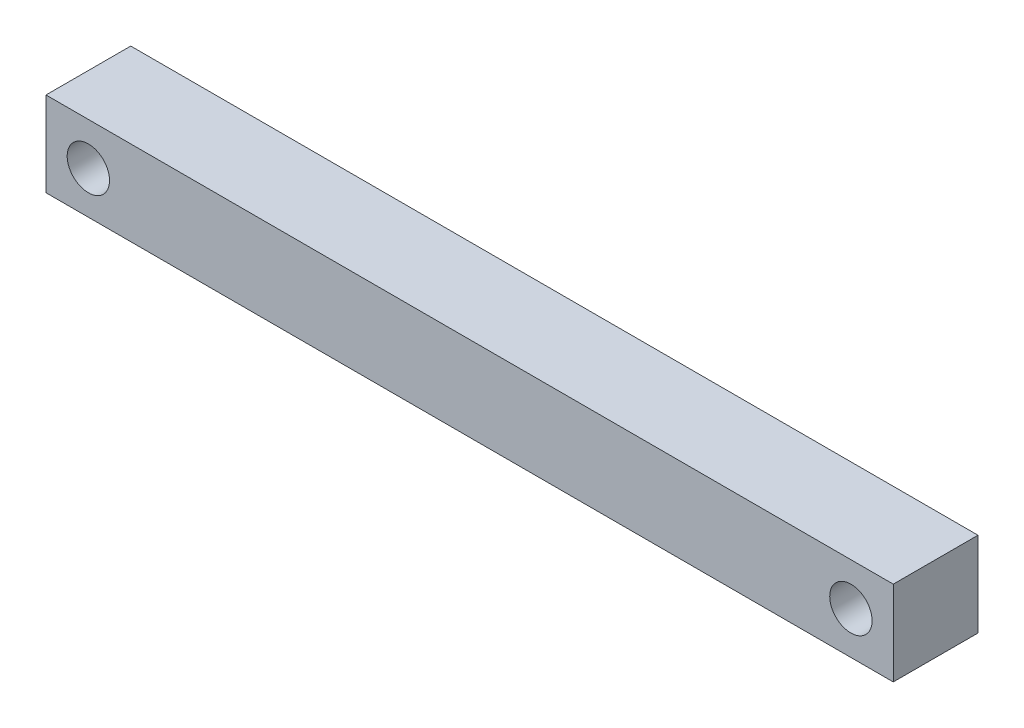
ISO-10303-21;
HEADER;
FILE_DESCRIPTION(('STEP AP214'),'2;1');
FILE_NAME('part.step','',(''),(''),'','','');
FILE_SCHEMA(('AUTOMOTIVE_DESIGN { 1 0 10303 214 1 1 1 1 }'));
ENDSEC;
DATA;
#1=APPLICATION_CONTEXT('core data for automotive mechanical design processes');
#2=APPLICATION_PROTOCOL_DEFINITION('international standard','automotive_design',2000,#1);
#3=PRODUCT_CONTEXT('',#1,'mechanical');
#4=PRODUCT('Part','Part','',(#3));
#5=PRODUCT_RELATED_PRODUCT_CATEGORY('part','',(#4));
#6=PRODUCT_DEFINITION_FORMATION('','',#4);
#7=PRODUCT_DEFINITION_CONTEXT('part definition',#1,'design');
#8=PRODUCT_DEFINITION('design','',#6,#7);
#9=PRODUCT_DEFINITION_SHAPE('','',#8);
#10=(LENGTH_UNIT() NAMED_UNIT(*) SI_UNIT(.MILLI.,.METRE.));
#11=(NAMED_UNIT(*) PLANE_ANGLE_UNIT() SI_UNIT($,.RADIAN.));
#12=(NAMED_UNIT(*) SI_UNIT($,.STERADIAN.) SOLID_ANGLE_UNIT());
#13=UNCERTAINTY_MEASURE_WITH_UNIT(LENGTH_MEASURE(1.E-05),#10,'distance_accuracy_value','');
#14=(GEOMETRIC_REPRESENTATION_CONTEXT(3) GLOBAL_UNCERTAINTY_ASSIGNED_CONTEXT((#13)) GLOBAL_UNIT_ASSIGNED_CONTEXT((#10,
#11,#12)) REPRESENTATION_CONTEXT('',''));
#15=CARTESIAN_POINT('',(0.,0.,0.));
#16=DIRECTION('',(0.,0.,1.));
#17=DIRECTION('',(1.,0.,0.));
#18=AXIS2_PLACEMENT_3D('',#15,#16,#17);
#19=CARTESIAN_POINT('',(100.,10.,20.));
#20=DIRECTION('',(-1.,0.,0.));
#21=DIRECTION('',(0.,-1.,0.));
#22=AXIS2_PLACEMENT_3D('',#19,#20,#21);
#23=PLANE('',#22);
#24=DIRECTION('',(0.,1.,0.));
#25=VECTOR('',#24,1.);
#26=CARTESIAN_POINT('',(100.,10.,0.));
#27=LINE('',#26,#25);
#28=CARTESIAN_POINT('',(100.,-10.,0.));
#29=VERTEX_POINT('',#28);
#30=CARTESIAN_POINT('',(100.,10.,0.));
#31=VERTEX_POINT('',#30);
#32=EDGE_CURVE('E101',#29,#31,#27,.T.);
#33=ORIENTED_EDGE('',*,*,#32,.T.);
#34=DIRECTION('',(0.,0.,-1.));
#35=VECTOR('',#34,1.);
#36=CARTESIAN_POINT('',(100.,10.,20.));
#37=LINE('',#36,#35);
#38=CARTESIAN_POINT('',(100.,10.,20.));
#39=VERTEX_POINT('',#38);
#40=EDGE_CURVE('E11',#39,#31,#37,.T.);
#41=ORIENTED_EDGE('',*,*,#40,.F.);
#42=DIRECTION('',(0.,1.,0.));
#43=VECTOR('',#42,1.);
#44=CARTESIAN_POINT('',(100.,10.,20.));
#45=LINE('',#44,#43);
#46=CARTESIAN_POINT('',(100.,-10.,20.));
#47=VERTEX_POINT('',#46);
#48=EDGE_CURVE('E89',#47,#39,#45,.T.);
#49=ORIENTED_EDGE('',*,*,#48,.F.);
#50=DIRECTION('',(0.,0.,-1.));
#51=VECTOR('',#50,1.);
#52=CARTESIAN_POINT('',(100.,-10.,20.));
#53=LINE('',#52,#51);
#54=EDGE_CURVE('E97',#47,#29,#53,.T.);
#55=ORIENTED_EDGE('',*,*,#54,.T.);
#56=EDGE_LOOP('',(#33,#41,#49,#55));
#57=FACE_BOUND('',#56,.T.);
#58=ADVANCED_FACE('F38',(#57),#23,.F.);
#59=CARTESIAN_POINT('',(-100.,10.,20.));
#60=DIRECTION('',(0.,-1.,0.));
#61=DIRECTION('',(0.,0.,-1.));
#62=AXIS2_PLACEMENT_3D('',#59,#60,#61);
#63=PLANE('',#62);
#64=DIRECTION('',(-1.,0.,0.));
#65=VECTOR('',#64,1.);
#66=CARTESIAN_POINT('',(-100.,10.,0.));
#67=LINE('',#66,#65);
#68=CARTESIAN_POINT('',(-100.,10.,0.));
#69=VERTEX_POINT('',#68);
#70=EDGE_CURVE('E93',#31,#69,#67,.T.);
#71=ORIENTED_EDGE('',*,*,#70,.T.);
#72=DIRECTION('',(0.,0.,-1.));
#73=VECTOR('',#72,1.);
#74=CARTESIAN_POINT('',(-100.,10.,20.));
#75=LINE('',#74,#73);
#76=CARTESIAN_POINT('',(-100.,10.,20.));
#77=VERTEX_POINT('',#76);
#78=EDGE_CURVE('E46',#77,#69,#75,.T.);
#79=ORIENTED_EDGE('',*,*,#78,.F.);
#80=DIRECTION('',(-1.,0.,0.));
#81=VECTOR('',#80,1.);
#82=CARTESIAN_POINT('',(-100.,10.,20.));
#83=LINE('',#82,#81);
#84=EDGE_CURVE('E84',#39,#77,#83,.T.);
#85=ORIENTED_EDGE('',*,*,#84,.F.);
#86=ORIENTED_EDGE('',*,*,#40,.T.);
#87=EDGE_LOOP('',(#71,#79,#85,#86));
#88=FACE_BOUND('',#87,.T.);
#89=ADVANCED_FACE('F92',(#88),#63,.F.);
#90=CARTESIAN_POINT('',(-100.,10.,20.));
#91=DIRECTION('',(1.,0.,0.));
#92=DIRECTION('',(0.,0.,-1.));
#93=AXIS2_PLACEMENT_3D('',#90,#91,#92);
#94=PLANE('',#93);
#95=DIRECTION('',(0.,-1.,0.));
#96=VECTOR('',#95,1.);
#97=CARTESIAN_POINT('',(-100.,10.,0.));
#98=LINE('',#97,#96);
#99=CARTESIAN_POINT('',(-100.,-10.,0.));
#100=VERTEX_POINT('',#99);
#101=EDGE_CURVE('E71',#69,#100,#98,.T.);
#102=ORIENTED_EDGE('',*,*,#101,.T.);
#103=DIRECTION('',(0.,0.,-1.));
#104=VECTOR('',#103,1.);
#105=CARTESIAN_POINT('',(-100.,-10.,20.));
#106=LINE('',#105,#104);
#107=CARTESIAN_POINT('',(-100.,-10.,20.));
#108=VERTEX_POINT('',#107);
#109=EDGE_CURVE('E94',#108,#100,#106,.T.);
#110=ORIENTED_EDGE('',*,*,#109,.F.);
#111=DIRECTION('',(0.,-1.,0.));
#112=VECTOR('',#111,1.);
#113=CARTESIAN_POINT('',(-100.,10.,20.));
#114=LINE('',#113,#112);
#115=EDGE_CURVE('E87',#77,#108,#114,.T.);
#116=ORIENTED_EDGE('',*,*,#115,.F.);
#117=ORIENTED_EDGE('',*,*,#78,.T.);
#118=EDGE_LOOP('',(#102,#110,#116,#117));
#119=FACE_BOUND('',#118,.T.);
#120=ADVANCED_FACE('F95',(#119),#94,.F.);
#121=CARTESIAN_POINT('',(-100.,-10.,20.));
#122=DIRECTION('',(0.,1.,0.));
#123=DIRECTION('',(0.,0.,1.));
#124=AXIS2_PLACEMENT_3D('',#121,#122,#123);
#125=PLANE('',#124);
#126=DIRECTION('',(1.,0.,0.));
#127=VECTOR('',#126,1.);
#128=CARTESIAN_POINT('',(-100.,-10.,0.));
#129=LINE('',#128,#127);
#130=EDGE_CURVE('E77',#100,#29,#129,.T.);
#131=ORIENTED_EDGE('',*,*,#130,.T.);
#132=ORIENTED_EDGE('',*,*,#54,.F.);
#133=DIRECTION('',(1.,0.,0.));
#134=VECTOR('',#133,1.);
#135=CARTESIAN_POINT('',(-100.,-10.,20.));
#136=LINE('',#135,#134);
#137=EDGE_CURVE('E54',#108,#47,#136,.T.);
#138=ORIENTED_EDGE('',*,*,#137,.F.);
#139=ORIENTED_EDGE('',*,*,#109,.T.);
#140=EDGE_LOOP('',(#131,#132,#138,#139));
#141=FACE_BOUND('',#140,.T.);
#142=ADVANCED_FACE('F109',(#141),#125,.F.);
#143=CARTESIAN_POINT('',(0.,0.,20.));
#144=DIRECTION('',(0.,0.,1.));
#145=DIRECTION('',(1.,0.,0.));
#146=AXIS2_PLACEMENT_3D('',#143,#144,#145);
#147=PLANE('',#146);
#148=CARTESIAN_POINT('',(90.,0.,20.));
#149=DIRECTION('',(0.,0.,-1.));
#150=DIRECTION('',(-1.,0.,0.));
#151=AXIS2_PLACEMENT_3D('',#148,#149,#150);
#152=CIRCLE('',#151,5.);
#153=CARTESIAN_POINT('',(85.,0.,20.));
#154=VERTEX_POINT('',#153);
#155=EDGE_CURVE('E121',#154,#154,#152,.T.);
#156=ORIENTED_EDGE('',*,*,#155,.T.);
#157=EDGE_LOOP('',(#156));
#158=FACE_BOUND('',#157,.T.);
#159=CARTESIAN_POINT('',(-90.,0.,20.));
#160=DIRECTION('',(0.,0.,1.));
#161=DIRECTION('',(1.,0.,0.));
#162=AXIS2_PLACEMENT_3D('',#159,#160,#161);
#163=CIRCLE('',#162,5.);
#164=CARTESIAN_POINT('',(-85.,0.,20.));
#165=VERTEX_POINT('',#164);
#166=EDGE_CURVE('E115',#165,#165,#163,.T.);
#167=ORIENTED_EDGE('',*,*,#166,.F.);
#168=EDGE_LOOP('',(#167));
#169=FACE_BOUND('',#168,.T.);
#170=ORIENTED_EDGE('',*,*,#48,.T.);
#171=ORIENTED_EDGE('',*,*,#84,.T.);
#172=ORIENTED_EDGE('',*,*,#115,.T.);
#173=ORIENTED_EDGE('',*,*,#137,.T.);
#174=EDGE_LOOP('',(#170,#171,#172,#173));
#175=FACE_BOUND('',#174,.T.);
#176=ADVANCED_FACE('F85',(#158,#169,#175),#147,.T.);
#177=CARTESIAN_POINT('',(0.,0.,0.));
#178=DIRECTION('',(0.,0.,1.));
#179=DIRECTION('',(1.,0.,0.));
#180=AXIS2_PLACEMENT_3D('',#177,#178,#179);
#181=PLANE('',#180);
#182=CARTESIAN_POINT('',(90.,0.,0.));
#183=DIRECTION('',(0.,0.,-1.));
#184=DIRECTION('',(-1.,0.,0.));
#185=AXIS2_PLACEMENT_3D('',#182,#183,#184);
#186=CIRCLE('',#185,5.);
#187=CARTESIAN_POINT('',(85.,0.,0.));
#188=VERTEX_POINT('',#187);
#189=EDGE_CURVE('E118',#188,#188,#186,.T.);
#190=ORIENTED_EDGE('',*,*,#189,.F.);
#191=EDGE_LOOP('',(#190));
#192=FACE_BOUND('',#191,.T.);
#193=CARTESIAN_POINT('',(-90.,0.,0.));
#194=DIRECTION('',(0.,0.,1.));
#195=DIRECTION('',(1.,0.,0.));
#196=AXIS2_PLACEMENT_3D('',#193,#194,#195);
#197=CIRCLE('',#196,5.);
#198=CARTESIAN_POINT('',(-85.,0.,0.));
#199=VERTEX_POINT('',#198);
#200=EDGE_CURVE('E104',#199,#199,#197,.T.);
#201=ORIENTED_EDGE('',*,*,#200,.T.);
#202=EDGE_LOOP('',(#201));
#203=FACE_BOUND('',#202,.T.);
#204=ORIENTED_EDGE('',*,*,#32,.F.);
#205=ORIENTED_EDGE('',*,*,#130,.F.);
#206=ORIENTED_EDGE('',*,*,#101,.F.);
#207=ORIENTED_EDGE('',*,*,#70,.F.);
#208=EDGE_LOOP('',(#204,#205,#206,#207));
#209=FACE_BOUND('',#208,.T.);
#210=ADVANCED_FACE('F112',(#192,#203,#209),#181,.F.);
#211=CARTESIAN_POINT('',(-90.,0.,0.));
#212=DIRECTION('',(0.,0.,1.));
#213=DIRECTION('',(1.,0.,0.));
#214=AXIS2_PLACEMENT_3D('',#211,#212,#213);
#215=CYLINDRICAL_SURFACE('',#214,5.);
#216=ORIENTED_EDGE('',*,*,#200,.F.);
#217=EDGE_LOOP('',(#216));
#218=FACE_BOUND('',#217,.T.);
#219=ORIENTED_EDGE('',*,*,#166,.T.);
#220=EDGE_LOOP('',(#219));
#221=FACE_BOUND('',#220,.T.);
#222=ADVANCED_FACE('F132',(#218,#221),#215,.F.);
#223=CARTESIAN_POINT('',(90.,0.,0.));
#224=DIRECTION('',(0.,0.,1.));
#225=DIRECTION('',(1.,0.,0.));
#226=AXIS2_PLACEMENT_3D('',#223,#224,#225);
#227=CYLINDRICAL_SURFACE('',#226,5.);
#228=ORIENTED_EDGE('',*,*,#189,.T.);
#229=EDGE_LOOP('',(#228));
#230=FACE_BOUND('',#229,.T.);
#231=ORIENTED_EDGE('',*,*,#155,.F.);
#232=EDGE_LOOP('',(#231));
#233=FACE_BOUND('',#232,.T.);
#234=ADVANCED_FACE('F127',(#230,#233),#227,.F.);
#235=CLOSED_SHELL('',(#58,#89,#120,#142,#176,#210,#222,#234));
#236=MANIFOLD_SOLID_BREP('B2',#235);
#237=ADVANCED_BREP_SHAPE_REPRESENTATION('',(#18,#236),#14);
#238=SHAPE_DEFINITION_REPRESENTATION(#9,#237);
ENDSEC;
END-ISO-10303-21;
